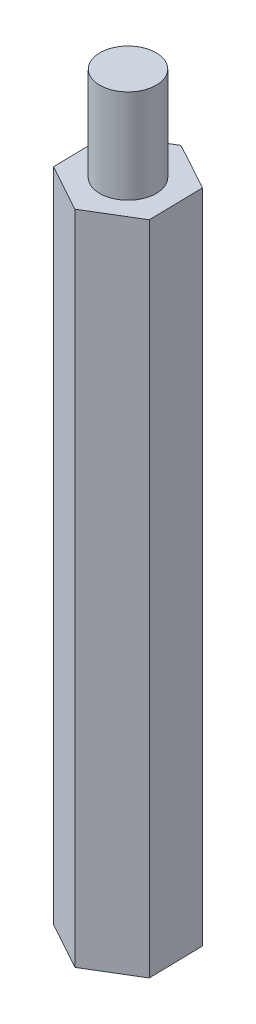
ISO-10303-21;
HEADER;
FILE_DESCRIPTION(('STEP AP214'),'2;1');
FILE_NAME('part.step','',(''),(''),'','','');
FILE_SCHEMA(('AUTOMOTIVE_DESIGN { 1 0 10303 214 1 1 1 1 }'));
ENDSEC;
DATA;
#1=APPLICATION_CONTEXT('core data for automotive mechanical design processes');
#2=APPLICATION_PROTOCOL_DEFINITION('international standard','automotive_design',2000,#1);
#3=PRODUCT_CONTEXT('',#1,'mechanical');
#4=PRODUCT('Part','Part','',(#3));
#5=PRODUCT_RELATED_PRODUCT_CATEGORY('part','',(#4));
#6=PRODUCT_DEFINITION_FORMATION('','',#4);
#7=PRODUCT_DEFINITION_CONTEXT('part definition',#1,'design');
#8=PRODUCT_DEFINITION('design','',#6,#7);
#9=PRODUCT_DEFINITION_SHAPE('','',#8);
#10=(LENGTH_UNIT() NAMED_UNIT(*) SI_UNIT(.MILLI.,.METRE.));
#11=(NAMED_UNIT(*) PLANE_ANGLE_UNIT() SI_UNIT($,.RADIAN.));
#12=(NAMED_UNIT(*) SI_UNIT($,.STERADIAN.) SOLID_ANGLE_UNIT());
#13=UNCERTAINTY_MEASURE_WITH_UNIT(LENGTH_MEASURE(1.E-05),#10,'distance_accuracy_value','');
#14=(GEOMETRIC_REPRESENTATION_CONTEXT(3) GLOBAL_UNCERTAINTY_ASSIGNED_CONTEXT((#13)) GLOBAL_UNIT_ASSIGNED_CONTEXT((#10,
#11,#12)) REPRESENTATION_CONTEXT('',''));
#15=CARTESIAN_POINT('',(0.,0.,0.));
#16=DIRECTION('',(0.,0.,1.));
#17=DIRECTION('',(1.,0.,0.));
#18=AXIS2_PLACEMENT_3D('',#15,#16,#17);
#19=CARTESIAN_POINT('',(0.0576517489458821,35.,2.8861756026231));
#20=DIRECTION('',(-0.517195803014658,0.,-0.855867104954983));
#21=DIRECTION('',(-0.855867104954983,0.,0.517195803014658));
#22=AXIS2_PLACEMENT_3D('',#19,#20,#21);
#23=PLANE('',#22);
#24=DIRECTION('',(0.855867104954983,0.,-0.517195803014658));
#25=VECTOR('',#24,1.);
#26=CARTESIAN_POINT('',(0.0576517489458821,0.,2.8861756026231));
#27=LINE('',#26,#25);
#28=CARTESIAN_POINT('',(0.0576517489458821,0.,2.8861756026231));
#29=VERTEX_POINT('',#28);
#30=CARTESIAN_POINT('',(2.52832726612741,0.,1.39315992215181));
#31=VERTEX_POINT('',#30);
#32=EDGE_CURVE('E121',#29,#31,#27,.T.);
#33=ORIENTED_EDGE('',*,*,#32,.T.);
#34=DIRECTION('',(0.,-1.,0.));
#35=VECTOR('',#34,1.);
#36=CARTESIAN_POINT('',(2.52832726612741,35.,1.39315992215181));
#37=LINE('',#36,#35);
#38=CARTESIAN_POINT('',(2.52832726612741,35.,1.39315992215181));
#39=VERTEX_POINT('',#38);
#40=EDGE_CURVE('E38',#39,#31,#37,.T.);
#41=ORIENTED_EDGE('',*,*,#40,.F.);
#42=DIRECTION('',(0.855867104954983,0.,-0.517195803014658));
#43=VECTOR('',#42,1.);
#44=CARTESIAN_POINT('',(0.0576517489458821,35.,2.8861756026231));
#45=LINE('',#44,#43);
#46=CARTESIAN_POINT('',(0.0576517489458821,35.,2.8861756026231));
#47=VERTEX_POINT('',#46);
#48=EDGE_CURVE('E132',#47,#39,#45,.T.);
#49=ORIENTED_EDGE('',*,*,#48,.F.);
#50=DIRECTION('',(0.,-1.,0.));
#51=VECTOR('',#50,1.);
#52=CARTESIAN_POINT('',(0.0576517489458821,35.,2.8861756026231));
#53=LINE('',#52,#51);
#54=EDGE_CURVE('E117',#47,#29,#53,.T.);
#55=ORIENTED_EDGE('',*,*,#54,.T.);
#56=EDGE_LOOP('',(#33,#41,#49,#55));
#57=FACE_BOUND('',#56,.T.);
#58=ADVANCED_FACE('F35',(#57),#23,.F.);
#59=CARTESIAN_POINT('',(2.52832726612741,35.,1.39315992215181));
#60=DIRECTION('',(-0.999800556661786,0.,0.0199711516638952));
#61=DIRECTION('',(0.0199711516638952,0.,0.999800556661786));
#62=AXIS2_PLACEMENT_3D('',#59,#60,#61);
#63=PLANE('',#62);
#64=DIRECTION('',(-0.0199711516638952,0.,-0.999800556661786));
#65=VECTOR('',#64,1.);
#66=CARTESIAN_POINT('',(2.52832726612741,0.,1.39315992215181));
#67=LINE('',#66,#65);
#68=CARTESIAN_POINT('',(2.47067551718152,0.,-1.49301568047129));
#69=VERTEX_POINT('',#68);
#70=EDGE_CURVE('E124',#31,#69,#67,.T.);
#71=ORIENTED_EDGE('',*,*,#70,.T.);
#72=DIRECTION('',(0.,-1.,0.));
#73=VECTOR('',#72,1.);
#74=CARTESIAN_POINT('',(2.47067551718152,35.,-1.49301568047129));
#75=LINE('',#74,#73);
#76=CARTESIAN_POINT('',(2.47067551718152,35.,-1.49301568047129));
#77=VERTEX_POINT('',#76);
#78=EDGE_CURVE('E135',#77,#69,#75,.T.);
#79=ORIENTED_EDGE('',*,*,#78,.F.);
#80=DIRECTION('',(-0.0199711516638952,0.,-0.999800556661786));
#81=VECTOR('',#80,1.);
#82=CARTESIAN_POINT('',(2.52832726612741,35.,1.39315992215181));
#83=LINE('',#82,#81);
#84=EDGE_CURVE('E90',#39,#77,#83,.T.);
#85=ORIENTED_EDGE('',*,*,#84,.F.);
#86=ORIENTED_EDGE('',*,*,#40,.T.);
#87=EDGE_LOOP('',(#71,#79,#85,#86));
#88=FACE_BOUND('',#87,.T.);
#89=ADVANCED_FACE('F140',(#88),#63,.F.);
#90=CARTESIAN_POINT('',(2.47067551718152,35.,-1.49301568047129));
#91=DIRECTION('',(-0.482604753647128,0.,0.875838256618877));
#92=DIRECTION('',(0.875838256618877,0.,0.482604753647128));
#93=AXIS2_PLACEMENT_3D('',#90,#91,#92);
#94=PLANE('',#93);
#95=DIRECTION('',(-0.875838256618877,0.,-0.482604753647128));
#96=VECTOR('',#95,1.);
#97=CARTESIAN_POINT('',(2.47067551718152,0.,-1.49301568047129));
#98=LINE('',#97,#96);
#99=CARTESIAN_POINT('',(-0.0576517489458831,0.,-2.8861756026231));
#100=VERTEX_POINT('',#99);
#101=EDGE_CURVE('E127',#69,#100,#98,.T.);
#102=ORIENTED_EDGE('',*,*,#101,.T.);
#103=DIRECTION('',(0.,-1.,0.));
#104=VECTOR('',#103,1.);
#105=CARTESIAN_POINT('',(-0.0576517489458831,35.,-2.8861756026231));
#106=LINE('',#105,#104);
#107=CARTESIAN_POINT('',(-0.0576517489458831,35.,-2.8861756026231));
#108=VERTEX_POINT('',#107);
#109=EDGE_CURVE('E112',#108,#100,#106,.T.);
#110=ORIENTED_EDGE('',*,*,#109,.F.);
#111=DIRECTION('',(-0.875838256618877,0.,-0.482604753647128));
#112=VECTOR('',#111,1.);
#113=CARTESIAN_POINT('',(2.47067551718152,35.,-1.49301568047129));
#114=LINE('',#113,#112);
#115=EDGE_CURVE('E103',#77,#108,#114,.T.);
#116=ORIENTED_EDGE('',*,*,#115,.F.);
#117=ORIENTED_EDGE('',*,*,#78,.T.);
#118=EDGE_LOOP('',(#102,#110,#116,#117));
#119=FACE_BOUND('',#118,.T.);
#120=ADVANCED_FACE('F146',(#119),#94,.F.);
#121=CARTESIAN_POINT('',(-0.0576517489458831,35.,-2.8861756026231));
#122=DIRECTION('',(0.517195803014658,0.,0.855867104954983));
#123=DIRECTION('',(0.855867104954982,0.,-0.517195803014658));
#124=AXIS2_PLACEMENT_3D('',#121,#122,#123);
#125=PLANE('',#124);
#126=DIRECTION('',(-0.855867104954982,0.,0.517195803014658));
#127=VECTOR('',#126,1.);
#128=CARTESIAN_POINT('',(-0.0576517489458831,0.,-2.8861756026231));
#129=LINE('',#128,#127);
#130=CARTESIAN_POINT('',(-2.52832726612741,0.,-1.39315992215181));
#131=VERTEX_POINT('',#130);
#132=EDGE_CURVE('E111',#100,#131,#129,.T.);
#133=ORIENTED_EDGE('',*,*,#132,.T.);
#134=DIRECTION('',(0.,-1.,0.));
#135=VECTOR('',#134,1.);
#136=CARTESIAN_POINT('',(-2.52832726612741,35.,-1.39315992215181));
#137=LINE('',#136,#135);
#138=CARTESIAN_POINT('',(-2.52832726612741,35.,-1.39315992215181));
#139=VERTEX_POINT('',#138);
#140=EDGE_CURVE('E108',#139,#131,#137,.T.);
#141=ORIENTED_EDGE('',*,*,#140,.F.);
#142=DIRECTION('',(-0.855867104954982,0.,0.517195803014658));
#143=VECTOR('',#142,1.);
#144=CARTESIAN_POINT('',(-0.0576517489458831,35.,-2.8861756026231));
#145=LINE('',#144,#143);
#146=EDGE_CURVE('E97',#108,#139,#145,.T.);
#147=ORIENTED_EDGE('',*,*,#146,.F.);
#148=ORIENTED_EDGE('',*,*,#109,.T.);
#149=EDGE_LOOP('',(#133,#141,#147,#148));
#150=FACE_BOUND('',#149,.T.);
#151=ADVANCED_FACE('F109',(#150),#125,.F.);
#152=CARTESIAN_POINT('',(-2.52832726612741,35.,-1.39315992215181));
#153=DIRECTION('',(0.999800556661786,0.,-0.0199711516638949));
#154=DIRECTION('',(-0.0199711516638949,0.,-0.999800556661786));
#155=AXIS2_PLACEMENT_3D('',#152,#153,#154);
#156=PLANE('',#155);
#157=DIRECTION('',(0.0199711516638949,0.,0.999800556661786));
#158=VECTOR('',#157,1.);
#159=CARTESIAN_POINT('',(-2.52832726612741,0.,-1.39315992215181));
#160=LINE('',#159,#158);
#161=CARTESIAN_POINT('',(-2.47067551718153,0.,1.49301568047129));
#162=VERTEX_POINT('',#161);
#163=EDGE_CURVE('E75',#131,#162,#160,.T.);
#164=ORIENTED_EDGE('',*,*,#163,.T.);
#165=DIRECTION('',(0.,-1.,0.));
#166=VECTOR('',#165,1.);
#167=CARTESIAN_POINT('',(-2.47067551718153,35.,1.49301568047129));
#168=LINE('',#167,#166);
#169=CARTESIAN_POINT('',(-2.47067551718153,35.,1.49301568047129));
#170=VERTEX_POINT('',#169);
#171=EDGE_CURVE('E113',#170,#162,#168,.T.);
#172=ORIENTED_EDGE('',*,*,#171,.F.);
#173=DIRECTION('',(0.0199711516638949,0.,0.999800556661786));
#174=VECTOR('',#173,1.);
#175=CARTESIAN_POINT('',(-2.52832726612741,35.,-1.39315992215181));
#176=LINE('',#175,#174);
#177=EDGE_CURVE('E101',#139,#170,#176,.T.);
#178=ORIENTED_EDGE('',*,*,#177,.F.);
#179=ORIENTED_EDGE('',*,*,#140,.T.);
#180=EDGE_LOOP('',(#164,#172,#178,#179));
#181=FACE_BOUND('',#180,.T.);
#182=ADVANCED_FACE('F115',(#181),#156,.F.);
#183=CARTESIAN_POINT('',(-2.47067551718153,35.,1.49301568047129));
#184=DIRECTION('',(0.482604753647128,0.,-0.875838256618877));
#185=DIRECTION('',(-0.875838256618877,0.,-0.482604753647128));
#186=AXIS2_PLACEMENT_3D('',#183,#184,#185);
#187=PLANE('',#186);
#188=DIRECTION('',(0.875838256618877,0.,0.482604753647128));
#189=VECTOR('',#188,1.);
#190=CARTESIAN_POINT('',(-2.47067551718153,0.,1.49301568047129));
#191=LINE('',#190,#189);
#192=EDGE_CURVE('E81',#162,#29,#191,.T.);
#193=ORIENTED_EDGE('',*,*,#192,.T.);
#194=ORIENTED_EDGE('',*,*,#54,.F.);
#195=DIRECTION('',(0.875838256618877,0.,0.482604753647128));
#196=VECTOR('',#195,1.);
#197=CARTESIAN_POINT('',(-2.47067551718153,35.,1.49301568047129));
#198=LINE('',#197,#196);
#199=EDGE_CURVE('E52',#170,#47,#198,.T.);
#200=ORIENTED_EDGE('',*,*,#199,.F.);
#201=ORIENTED_EDGE('',*,*,#171,.T.);
#202=EDGE_LOOP('',(#193,#194,#200,#201));
#203=FACE_BOUND('',#202,.T.);
#204=ADVANCED_FACE('F169',(#203),#187,.F.);
#205=CARTESIAN_POINT('',(0.,35.,0.));
#206=DIRECTION('',(0.,1.,0.));
#207=DIRECTION('',(0.,0.,1.));
#208=AXIS2_PLACEMENT_3D('',#205,#206,#207);
#209=PLANE('',#208);
#210=CARTESIAN_POINT('',(0.,35.,0.));
#211=DIRECTION('',(0.,1.,0.));
#212=DIRECTION('',(0.,0.,1.));
#213=AXIS2_PLACEMENT_3D('',#210,#211,#212);
#214=CIRCLE('',#213,1.5);
#215=CARTESIAN_POINT('',(0.,35.,1.5));
#216=VERTEX_POINT('',#215);
#217=EDGE_CURVE('E11',#216,#216,#214,.T.);
#218=ORIENTED_EDGE('',*,*,#217,.F.);
#219=EDGE_LOOP('',(#218));
#220=FACE_BOUND('',#219,.T.);
#221=ORIENTED_EDGE('',*,*,#48,.T.);
#222=ORIENTED_EDGE('',*,*,#84,.T.);
#223=ORIENTED_EDGE('',*,*,#115,.T.);
#224=ORIENTED_EDGE('',*,*,#146,.T.);
#225=ORIENTED_EDGE('',*,*,#177,.T.);
#226=ORIENTED_EDGE('',*,*,#199,.T.);
#227=EDGE_LOOP('',(#221,#222,#223,#224,#225,#226));
#228=FACE_BOUND('',#227,.T.);
#229=ADVANCED_FACE('F99',(#220,#228),#209,.T.);
#230=CARTESIAN_POINT('',(0.,0.,0.));
#231=DIRECTION('',(0.,1.,0.));
#232=DIRECTION('',(0.,0.,1.));
#233=AXIS2_PLACEMENT_3D('',#230,#231,#232);
#234=PLANE('',#233);
#235=CARTESIAN_POINT('',(0.,0.,0.));
#236=DIRECTION('',(0.,-1.,0.));
#237=DIRECTION('',(0.,0.,-1.));
#238=AXIS2_PLACEMENT_3D('',#235,#236,#237);
#239=CIRCLE('',#238,1.5);
#240=CARTESIAN_POINT('',(0.,0.,-1.5));
#241=VERTEX_POINT('',#240);
#242=EDGE_CURVE('E150',#241,#241,#239,.T.);
#243=ORIENTED_EDGE('',*,*,#242,.F.);
#244=EDGE_LOOP('',(#243));
#245=FACE_BOUND('',#244,.T.);
#246=ORIENTED_EDGE('',*,*,#32,.F.);
#247=ORIENTED_EDGE('',*,*,#192,.F.);
#248=ORIENTED_EDGE('',*,*,#163,.F.);
#249=ORIENTED_EDGE('',*,*,#132,.F.);
#250=ORIENTED_EDGE('',*,*,#101,.F.);
#251=ORIENTED_EDGE('',*,*,#70,.F.);
#252=EDGE_LOOP('',(#246,#247,#248,#249,#250,#251));
#253=FACE_BOUND('',#252,.T.);
#254=ADVANCED_FACE('F145',(#245,#253),#234,.F.);
#255=CARTESIAN_POINT('',(0.,5.,0.));
#256=DIRECTION('',(0.,-1.,0.));
#257=DIRECTION('',(0.,0.,-1.));
#258=AXIS2_PLACEMENT_3D('',#255,#256,#257);
#259=CYLINDRICAL_SURFACE('',#258,1.5);
#260=CARTESIAN_POINT('',(0.,5.,0.));
#261=DIRECTION('',(0.,-1.,0.));
#262=DIRECTION('',(0.,0.,-1.));
#263=AXIS2_PLACEMENT_3D('',#260,#261,#262);
#264=CIRCLE('',#263,1.5);
#265=CARTESIAN_POINT('',(0.,5.,-1.5));
#266=VERTEX_POINT('',#265);
#267=EDGE_CURVE('E125',#266,#266,#264,.T.);
#268=ORIENTED_EDGE('',*,*,#267,.F.);
#269=EDGE_LOOP('',(#268));
#270=FACE_BOUND('',#269,.T.);
#271=ORIENTED_EDGE('',*,*,#242,.T.);
#272=EDGE_LOOP('',(#271));
#273=FACE_BOUND('',#272,.T.);
#274=ADVANCED_FACE('F175',(#270,#273),#259,.F.);
#275=CARTESIAN_POINT('',(0.,5.,0.));
#276=DIRECTION('',(0.,-1.,0.));
#277=DIRECTION('',(0.,0.,-1.));
#278=AXIS2_PLACEMENT_3D('',#275,#276,#277);
#279=PLANE('',#278);
#280=ORIENTED_EDGE('',*,*,#267,.T.);
#281=EDGE_LOOP('',(#280));
#282=FACE_BOUND('',#281,.T.);
#283=ADVANCED_FACE('F164',(#282),#279,.T.);
#284=CARTESIAN_POINT('',(0.,40.,0.));
#285=DIRECTION('',(0.,-1.,0.));
#286=DIRECTION('',(0.,0.,-1.));
#287=AXIS2_PLACEMENT_3D('',#284,#285,#286);
#288=CYLINDRICAL_SURFACE('',#287,1.5);
#289=CARTESIAN_POINT('',(0.,40.,0.));
#290=DIRECTION('',(0.,1.,0.));
#291=DIRECTION('',(0.,0.,1.));
#292=AXIS2_PLACEMENT_3D('',#289,#290,#291);
#293=CIRCLE('',#292,1.5);
#294=CARTESIAN_POINT('',(0.,40.,1.5));
#295=VERTEX_POINT('',#294);
#296=EDGE_CURVE('E153',#295,#295,#293,.T.);
#297=ORIENTED_EDGE('',*,*,#296,.F.);
#298=EDGE_LOOP('',(#297));
#299=FACE_BOUND('',#298,.T.);
#300=ORIENTED_EDGE('',*,*,#217,.T.);
#301=EDGE_LOOP('',(#300));
#302=FACE_BOUND('',#301,.T.);
#303=ADVANCED_FACE('F161',(#299,#302),#288,.T.);
#304=CARTESIAN_POINT('',(0.,40.,0.));
#305=DIRECTION('',(0.,1.,0.));
#306=DIRECTION('',(0.,0.,1.));
#307=AXIS2_PLACEMENT_3D('',#304,#305,#306);
#308=PLANE('',#307);
#309=ORIENTED_EDGE('',*,*,#296,.T.);
#310=EDGE_LOOP('',(#309));
#311=FACE_BOUND('',#310,.T.);
#312=ADVANCED_FACE('F159',(#311),#308,.T.);
#313=CLOSED_SHELL('',(#58,#89,#120,#151,#182,#204,#229,#254,#274,#283,#303,#312));
#314=MANIFOLD_SOLID_BREP('B2',#313);
#315=ADVANCED_BREP_SHAPE_REPRESENTATION('',(#18,#314),#14);
#316=SHAPE_DEFINITION_REPRESENTATION(#9,#315);
ENDSEC;
END-ISO-10303-21;
